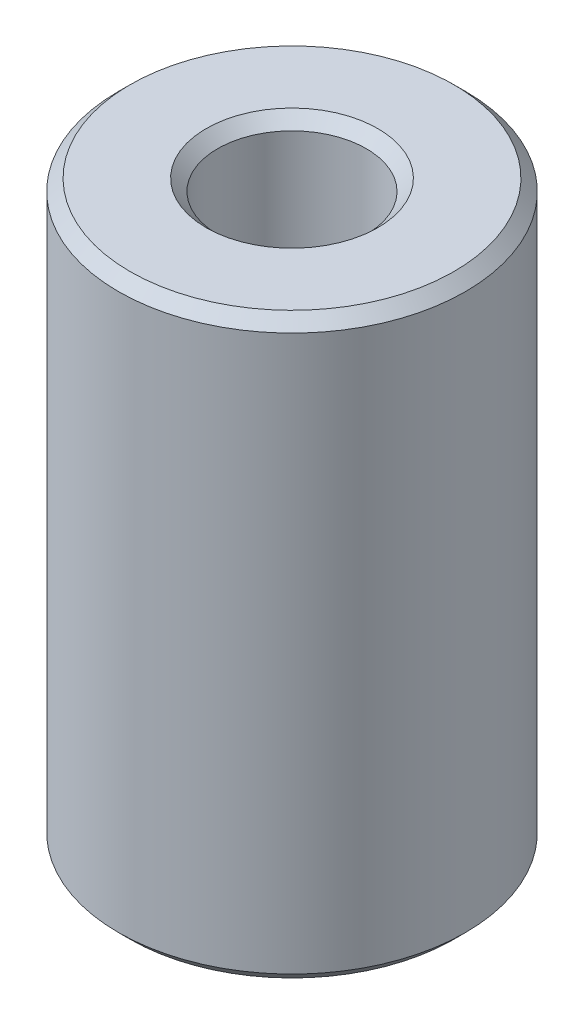
ISO-10303-21;
HEADER;
FILE_DESCRIPTION(('STEP AP214'),'2;1');
FILE_NAME('part.step','',(''),(''),'','','');
FILE_SCHEMA(('AUTOMOTIVE_DESIGN { 1 0 10303 214 1 1 1 1 }'));
ENDSEC;
DATA;
#1=APPLICATION_CONTEXT('core data for automotive mechanical design processes');
#2=APPLICATION_PROTOCOL_DEFINITION('international standard','automotive_design',2000,#1);
#3=PRODUCT_CONTEXT('',#1,'mechanical');
#4=PRODUCT('Part','Part','',(#3));
#5=PRODUCT_RELATED_PRODUCT_CATEGORY('part','',(#4));
#6=PRODUCT_DEFINITION_FORMATION('','',#4);
#7=PRODUCT_DEFINITION_CONTEXT('part definition',#1,'design');
#8=PRODUCT_DEFINITION('design','',#6,#7);
#9=PRODUCT_DEFINITION_SHAPE('','',#8);
#10=(LENGTH_UNIT() NAMED_UNIT(*) SI_UNIT(.MILLI.,.METRE.));
#11=(NAMED_UNIT(*) PLANE_ANGLE_UNIT() SI_UNIT($,.RADIAN.));
#12=(NAMED_UNIT(*) SI_UNIT($,.STERADIAN.) SOLID_ANGLE_UNIT());
#13=UNCERTAINTY_MEASURE_WITH_UNIT(LENGTH_MEASURE(1.E-05),#10,'distance_accuracy_value','');
#14=(GEOMETRIC_REPRESENTATION_CONTEXT(3) GLOBAL_UNCERTAINTY_ASSIGNED_CONTEXT((#13)) GLOBAL_UNIT_ASSIGNED_CONTEXT((#10,
#11,#12)) REPRESENTATION_CONTEXT('',''));
#15=CARTESIAN_POINT('',(0.,0.,0.));
#16=DIRECTION('',(0.,0.,1.));
#17=DIRECTION('',(1.,0.,0.));
#18=AXIS2_PLACEMENT_3D('',#15,#16,#17);
#19=CARTESIAN_POINT('',(0.,-12.7,0.));
#20=DIRECTION('',(0.,1.,0.));
#21=DIRECTION('',(0.,0.,1.));
#22=AXIS2_PLACEMENT_3D('',#19,#20,#21);
#23=CYLINDRICAL_SURFACE('',#22,3.81);
#24=CARTESIAN_POINT('',(0.,-12.446,0.));
#25=DIRECTION('',(0.,1.,0.));
#26=DIRECTION('',(0.,0.,1.));
#27=AXIS2_PLACEMENT_3D('',#24,#25,#26);
#28=CIRCLE('',#27,3.81);
#29=CARTESIAN_POINT('',(0.,-12.446,3.81));
#30=VERTEX_POINT('',#29);
#31=EDGE_CURVE('E57',#30,#30,#28,.T.);
#32=ORIENTED_EDGE('',*,*,#31,.T.);
#33=EDGE_LOOP('',(#32));
#34=FACE_BOUND('',#33,.T.);
#35=CARTESIAN_POINT('',(0.,-0.254000000000004,0.));
#36=DIRECTION('',(0.,1.,0.));
#37=DIRECTION('',(0.,0.,1.));
#38=AXIS2_PLACEMENT_3D('',#35,#36,#37);
#39=CIRCLE('',#38,3.81);
#40=CARTESIAN_POINT('',(0.,-0.254000000000004,3.81));
#41=VERTEX_POINT('',#40);
#42=EDGE_CURVE('E60',#41,#41,#39,.F.);
#43=ORIENTED_EDGE('',*,*,#42,.T.);
#44=EDGE_LOOP('',(#43));
#45=FACE_BOUND('',#44,.T.);
#46=ADVANCED_FACE('F31',(#34,#45),#23,.T.);
#47=CARTESIAN_POINT('',(0.,-12.7,0.));
#48=DIRECTION('',(0.,1.,0.));
#49=DIRECTION('',(0.,0.,1.));
#50=AXIS2_PLACEMENT_3D('',#47,#48,#49);
#51=PLANE('',#50);
#52=CARTESIAN_POINT('',(0.,-12.7,0.));
#53=DIRECTION('',(0.,1.,0.));
#54=DIRECTION('',(0.,0.,1.));
#55=AXIS2_PLACEMENT_3D('',#52,#53,#54);
#56=CIRCLE('',#55,3.556);
#57=CARTESIAN_POINT('',(0.,-12.7,3.556));
#58=VERTEX_POINT('',#57);
#59=EDGE_CURVE('E51',#58,#58,#56,.F.);
#60=ORIENTED_EDGE('',*,*,#59,.T.);
#61=EDGE_LOOP('',(#60));
#62=FACE_BOUND('',#61,.T.);
#63=CARTESIAN_POINT('',(0.,-12.7,0.));
#64=DIRECTION('',(0.,1.,0.));
#65=DIRECTION('',(0.,0.,1.));
#66=AXIS2_PLACEMENT_3D('',#63,#64,#65);
#67=CIRCLE('',#66,1.88595);
#68=CARTESIAN_POINT('',(0.,-12.7,1.88595));
#69=VERTEX_POINT('',#68);
#70=EDGE_CURVE('E54',#69,#69,#67,.T.);
#71=ORIENTED_EDGE('',*,*,#70,.T.);
#72=EDGE_LOOP('',(#71));
#73=FACE_BOUND('',#72,.T.);
#74=ADVANCED_FACE('F78',(#62,#73),#51,.F.);
#75=CARTESIAN_POINT('',(0.,0.,0.));
#76=DIRECTION('',(0.,1.,0.));
#77=DIRECTION('',(0.,0.,1.));
#78=AXIS2_PLACEMENT_3D('',#75,#76,#77);
#79=PLANE('',#78);
#80=CARTESIAN_POINT('',(0.,0.,0.));
#81=DIRECTION('',(0.,1.,0.));
#82=DIRECTION('',(0.,0.,1.));
#83=AXIS2_PLACEMENT_3D('',#80,#81,#82);
#84=CIRCLE('',#83,3.556);
#85=CARTESIAN_POINT('',(0.,0.,3.556));
#86=VERTEX_POINT('',#85);
#87=EDGE_CURVE('E10',#86,#86,#84,.T.);
#88=ORIENTED_EDGE('',*,*,#87,.T.);
#89=EDGE_LOOP('',(#88));
#90=FACE_BOUND('',#89,.T.);
#91=CARTESIAN_POINT('',(0.,0.,0.));
#92=DIRECTION('',(0.,1.,0.));
#93=DIRECTION('',(0.,0.,1.));
#94=AXIS2_PLACEMENT_3D('',#91,#92,#93);
#95=CIRCLE('',#94,1.88595);
#96=CARTESIAN_POINT('',(0.,0.,1.88595));
#97=VERTEX_POINT('',#96);
#98=EDGE_CURVE('E38',#97,#97,#95,.F.);
#99=ORIENTED_EDGE('',*,*,#98,.T.);
#100=EDGE_LOOP('',(#99));
#101=FACE_BOUND('',#100,.T.);
#102=ADVANCED_FACE('F84',(#90,#101),#79,.T.);
#103=CARTESIAN_POINT('',(0.,0.,0.));
#104=DIRECTION('',(0.,1.,0.));
#105=DIRECTION('',(0.,0.,1.));
#106=AXIS2_PLACEMENT_3D('',#103,#104,#105);
#107=CYLINDRICAL_SURFACE('',#106,1.63195);
#108=CARTESIAN_POINT('',(0.,-12.446,0.));
#109=DIRECTION('',(0.,1.,0.));
#110=DIRECTION('',(0.,0.,1.));
#111=AXIS2_PLACEMENT_3D('',#108,#109,#110);
#112=CIRCLE('',#111,1.63195);
#113=CARTESIAN_POINT('',(0.,-12.446,1.63195));
#114=VERTEX_POINT('',#113);
#115=EDGE_CURVE('E42',#114,#114,#112,.F.);
#116=ORIENTED_EDGE('',*,*,#115,.T.);
#117=EDGE_LOOP('',(#116));
#118=FACE_BOUND('',#117,.T.);
#119=CARTESIAN_POINT('',(0.,-0.254,0.));
#120=DIRECTION('',(0.,1.,0.));
#121=DIRECTION('',(0.,0.,1.));
#122=AXIS2_PLACEMENT_3D('',#119,#120,#121);
#123=CIRCLE('',#122,1.63195);
#124=CARTESIAN_POINT('',(0.,-0.254,1.63195));
#125=VERTEX_POINT('',#124);
#126=EDGE_CURVE('E46',#125,#125,#123,.T.);
#127=ORIENTED_EDGE('',*,*,#126,.T.);
#128=EDGE_LOOP('',(#127));
#129=FACE_BOUND('',#128,.T.);
#130=ADVANCED_FACE('F90',(#118,#129),#107,.F.);
#131=CARTESIAN_POINT('',(0.,-12.446,0.));
#132=DIRECTION('',(0.,1.,0.));
#133=DIRECTION('',(0.,0.,1.));
#134=AXIS2_PLACEMENT_3D('',#131,#132,#133);
#135=CONICAL_SURFACE('',#134,3.81,0.785398163397451);
#136=ORIENTED_EDGE('',*,*,#59,.F.);
#137=EDGE_LOOP('',(#136));
#138=FACE_BOUND('',#137,.T.);
#139=ORIENTED_EDGE('',*,*,#31,.F.);
#140=EDGE_LOOP('',(#139));
#141=FACE_BOUND('',#140,.T.);
#142=ADVANCED_FACE('F74',(#138,#141),#135,.T.);
#143=CARTESIAN_POINT('',(0.,-12.7,0.));
#144=DIRECTION('',(0.,-1.,0.));
#145=DIRECTION('',(0.,0.,-1.));
#146=AXIS2_PLACEMENT_3D('',#143,#144,#145);
#147=CONICAL_SURFACE('',#146,1.88595,0.785398163397446);
#148=ORIENTED_EDGE('',*,*,#115,.F.);
#149=EDGE_LOOP('',(#148));
#150=FACE_BOUND('',#149,.T.);
#151=ORIENTED_EDGE('',*,*,#70,.F.);
#152=EDGE_LOOP('',(#151));
#153=FACE_BOUND('',#152,.T.);
#154=ADVANCED_FACE('F68',(#150,#153),#147,.F.);
#155=CARTESIAN_POINT('',(0.,0.,0.));
#156=DIRECTION('',(0.,-1.,0.));
#157=DIRECTION('',(0.,0.,-1.));
#158=AXIS2_PLACEMENT_3D('',#155,#156,#157);
#159=CONICAL_SURFACE('',#158,3.556,0.785398163397444);
#160=ORIENTED_EDGE('',*,*,#42,.F.);
#161=EDGE_LOOP('',(#160));
#162=FACE_BOUND('',#161,.T.);
#163=ORIENTED_EDGE('',*,*,#87,.F.);
#164=EDGE_LOOP('',(#163));
#165=FACE_BOUND('',#164,.T.);
#166=ADVANCED_FACE('F65',(#162,#165),#159,.T.);
#167=CARTESIAN_POINT('',(0.,-0.254,0.));
#168=DIRECTION('',(0.,1.,0.));
#169=DIRECTION('',(0.,0.,1.));
#170=AXIS2_PLACEMENT_3D('',#167,#168,#169);
#171=CONICAL_SURFACE('',#170,1.63195,0.78539816339745);
#172=ORIENTED_EDGE('',*,*,#98,.F.);
#173=EDGE_LOOP('',(#172));
#174=FACE_BOUND('',#173,.T.);
#175=ORIENTED_EDGE('',*,*,#126,.F.);
#176=EDGE_LOOP('',(#175));
#177=FACE_BOUND('',#176,.T.);
#178=ADVANCED_FACE('F33',(#174,#177),#171,.F.);
#179=CLOSED_SHELL('',(#46,#74,#102,#130,#142,#154,#166,#178));
#180=MANIFOLD_SOLID_BREP('B2',#179);
#181=ADVANCED_BREP_SHAPE_REPRESENTATION('',(#18,#180),#14);
#182=SHAPE_DEFINITION_REPRESENTATION(#9,#181);
ENDSEC;
END-ISO-10303-21;
